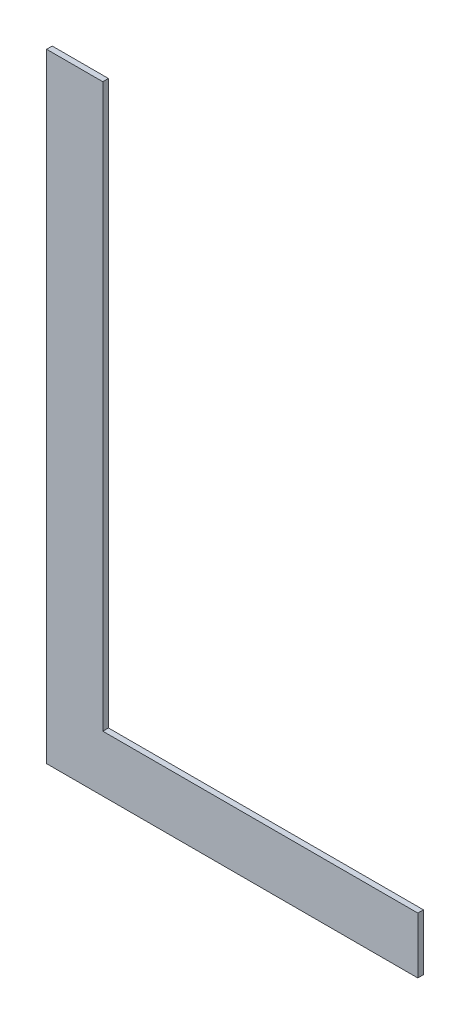
ISO-10303-21;
HEADER;
FILE_DESCRIPTION(('STEP AP214'),'2;1');
FILE_NAME('part.step','',(''),(''),'','','');
FILE_SCHEMA(('AUTOMOTIVE_DESIGN { 1 0 10303 214 1 1 1 1 }'));
ENDSEC;
DATA;
#1=APPLICATION_CONTEXT('core data for automotive mechanical design processes');
#2=APPLICATION_PROTOCOL_DEFINITION('international standard','automotive_design',2000,#1);
#3=PRODUCT_CONTEXT('',#1,'mechanical');
#4=PRODUCT('Part','Part','',(#3));
#5=PRODUCT_RELATED_PRODUCT_CATEGORY('part','',(#4));
#6=PRODUCT_DEFINITION_FORMATION('','',#4);
#7=PRODUCT_DEFINITION_CONTEXT('part definition',#1,'design');
#8=PRODUCT_DEFINITION('design','',#6,#7);
#9=PRODUCT_DEFINITION_SHAPE('','',#8);
#10=(LENGTH_UNIT() NAMED_UNIT(*) SI_UNIT(.MILLI.,.METRE.));
#11=(NAMED_UNIT(*) PLANE_ANGLE_UNIT() SI_UNIT($,.RADIAN.));
#12=(NAMED_UNIT(*) SI_UNIT($,.STERADIAN.) SOLID_ANGLE_UNIT());
#13=UNCERTAINTY_MEASURE_WITH_UNIT(LENGTH_MEASURE(1.E-05),#10,'distance_accuracy_value','');
#14=(GEOMETRIC_REPRESENTATION_CONTEXT(3) GLOBAL_UNCERTAINTY_ASSIGNED_CONTEXT((#13)) GLOBAL_UNIT_ASSIGNED_CONTEXT((#10,
#11,#12)) REPRESENTATION_CONTEXT('',''));
#15=CARTESIAN_POINT('',(0.,0.,0.));
#16=DIRECTION('',(0.,0.,1.));
#17=DIRECTION('',(1.,0.,0.));
#18=AXIS2_PLACEMENT_3D('',#15,#16,#17);
#19=CARTESIAN_POINT('',(-0.32999934,0.55000144,0.01));
#20=DIRECTION('',(0.,0.,-1.));
#21=DIRECTION('',(-1.,0.,0.));
#22=AXIS2_PLACEMENT_3D('',#19,#20,#21);
#23=PLANE('',#22);
#24=DIRECTION('',(1.,0.,0.));
#25=VECTOR('',#24,1.);
#26=CARTESIAN_POINT('',(-0.32999934,-0.5499989,0.01));
#27=LINE('',#26,#25);
#28=CARTESIAN_POINT('',(-0.32999934,-0.5499989,0.01));
#29=VERTEX_POINT('',#28);
#30=CARTESIAN_POINT('',(0.32999934,-0.5499989,0.01));
#31=VERTEX_POINT('',#30);
#32=EDGE_CURVE('E96',#29,#31,#27,.T.);
#33=ORIENTED_EDGE('',*,*,#32,.T.);
#34=DIRECTION('',(0.,1.,0.));
#35=VECTOR('',#34,1.);
#36=CARTESIAN_POINT('',(0.32999934,-0.5499989,0.01));
#37=LINE('',#36,#35);
#38=CARTESIAN_POINT('',(0.32999934,-0.4499991,0.01));
#39=VERTEX_POINT('',#38);
#40=EDGE_CURVE('E92',#31,#39,#37,.T.);
#41=ORIENTED_EDGE('',*,*,#40,.T.);
#42=DIRECTION('',(1.,0.,0.));
#43=VECTOR('',#42,1.);
#44=CARTESIAN_POINT('',(0.32999934,-0.4499991,0.01));
#45=LINE('',#44,#43);
#46=CARTESIAN_POINT('',(-0.22999954,-0.4499991,0.01));
#47=VERTEX_POINT('',#46);
#48=EDGE_CURVE('E68',#39,#47,#45,.F.);
#49=ORIENTED_EDGE('',*,*,#48,.T.);
#50=DIRECTION('',(0.,1.,0.));
#51=VECTOR('',#50,1.);
#52=CARTESIAN_POINT('',(-0.22999954,-0.4499991,0.01));
#53=LINE('',#52,#51);
#54=CARTESIAN_POINT('',(-0.22999954,0.55000144,0.01));
#55=VERTEX_POINT('',#54);
#56=EDGE_CURVE('E70',#47,#55,#53,.T.);
#57=ORIENTED_EDGE('',*,*,#56,.T.);
#58=DIRECTION('',(1.,0.,0.));
#59=VECTOR('',#58,1.);
#60=CARTESIAN_POINT('',(-0.22999954,0.55000144,0.01));
#61=LINE('',#60,#59);
#62=CARTESIAN_POINT('',(-0.32999934,0.55000144,0.01));
#63=VERTEX_POINT('',#62);
#64=EDGE_CURVE('E20',#55,#63,#61,.F.);
#65=ORIENTED_EDGE('',*,*,#64,.T.);
#66=DIRECTION('',(0.,1.,0.));
#67=VECTOR('',#66,1.);
#68=CARTESIAN_POINT('',(-0.32999934,0.55000144,0.01));
#69=LINE('',#68,#67);
#70=EDGE_CURVE('E101',#63,#29,#69,.F.);
#71=ORIENTED_EDGE('',*,*,#70,.T.);
#72=EDGE_LOOP('',(#33,#41,#49,#57,#65,#71));
#73=FACE_BOUND('',#72,.T.);
#74=ADVANCED_FACE('F17',(#73),#23,.F.);
#75=CARTESIAN_POINT('',(-0.22999954,0.55000144,0.));
#76=DIRECTION('',(0.,-1.,0.));
#77=DIRECTION('',(0.,0.,-1.));
#78=AXIS2_PLACEMENT_3D('',#75,#76,#77);
#79=PLANE('',#78);
#80=DIRECTION('',(0.,0.,-1.));
#81=VECTOR('',#80,1.);
#82=CARTESIAN_POINT('',(-0.32999934,0.55000144,0.));
#83=LINE('',#82,#81);
#84=CARTESIAN_POINT('',(-0.32999934,0.55000144,0.));
#85=VERTEX_POINT('',#84);
#86=EDGE_CURVE('E81',#85,#63,#83,.F.);
#87=ORIENTED_EDGE('',*,*,#86,.T.);
#88=ORIENTED_EDGE('',*,*,#64,.F.);
#89=DIRECTION('',(0.,0.,1.));
#90=VECTOR('',#89,1.);
#91=CARTESIAN_POINT('',(-0.22999954,0.55000144,0.));
#92=LINE('',#91,#90);
#93=CARTESIAN_POINT('',(-0.22999954,0.55000144,0.));
#94=VERTEX_POINT('',#93);
#95=EDGE_CURVE('E76',#55,#94,#92,.F.);
#96=ORIENTED_EDGE('',*,*,#95,.T.);
#97=DIRECTION('',(-1.,0.,0.));
#98=VECTOR('',#97,1.);
#99=CARTESIAN_POINT('',(-0.32999934,0.55000144,0.));
#100=LINE('',#99,#98);
#101=EDGE_CURVE('E104',#85,#94,#100,.F.);
#102=ORIENTED_EDGE('',*,*,#101,.F.);
#103=EDGE_LOOP('',(#87,#88,#96,#102));
#104=FACE_BOUND('',#103,.T.);
#105=ADVANCED_FACE('F78',(#104),#79,.F.);
#106=CARTESIAN_POINT('',(-0.22999954,-0.4499991,0.));
#107=DIRECTION('',(-1.,0.,0.));
#108=DIRECTION('',(0.,0.,1.));
#109=AXIS2_PLACEMENT_3D('',#106,#107,#108);
#110=PLANE('',#109);
#111=ORIENTED_EDGE('',*,*,#95,.F.);
#112=ORIENTED_EDGE('',*,*,#56,.F.);
#113=DIRECTION('',(0.,0.,-1.));
#114=VECTOR('',#113,1.);
#115=CARTESIAN_POINT('',(-0.22999954,-0.4499991,0.));
#116=LINE('',#115,#114);
#117=CARTESIAN_POINT('',(-0.22999954,-0.4499991,0.));
#118=VERTEX_POINT('',#117);
#119=EDGE_CURVE('E88',#47,#118,#116,.T.);
#120=ORIENTED_EDGE('',*,*,#119,.T.);
#121=DIRECTION('',(0.,1.,0.));
#122=VECTOR('',#121,1.);
#123=CARTESIAN_POINT('',(-0.22999954,0.55000144,0.));
#124=LINE('',#123,#122);
#125=EDGE_CURVE('E85',#94,#118,#124,.F.);
#126=ORIENTED_EDGE('',*,*,#125,.F.);
#127=EDGE_LOOP('',(#111,#112,#120,#126));
#128=FACE_BOUND('',#127,.T.);
#129=ADVANCED_FACE('F83',(#128),#110,.F.);
#130=CARTESIAN_POINT('',(0.32999934,-0.4499991,0.));
#131=DIRECTION('',(0.,-1.,0.));
#132=DIRECTION('',(0.,0.,-1.));
#133=AXIS2_PLACEMENT_3D('',#130,#131,#132);
#134=PLANE('',#133);
#135=ORIENTED_EDGE('',*,*,#119,.F.);
#136=ORIENTED_EDGE('',*,*,#48,.F.);
#137=DIRECTION('',(0.,0.,1.));
#138=VECTOR('',#137,1.);
#139=CARTESIAN_POINT('',(0.32999934,-0.4499991,0.));
#140=LINE('',#139,#138);
#141=CARTESIAN_POINT('',(0.32999934,-0.4499991,0.));
#142=VERTEX_POINT('',#141);
#143=EDGE_CURVE('E94',#39,#142,#140,.F.);
#144=ORIENTED_EDGE('',*,*,#143,.T.);
#145=DIRECTION('',(-1.,0.,0.));
#146=VECTOR('',#145,1.);
#147=CARTESIAN_POINT('',(-0.32999934,-0.4499991,0.));
#148=LINE('',#147,#146);
#149=EDGE_CURVE('E107',#118,#142,#148,.F.);
#150=ORIENTED_EDGE('',*,*,#149,.F.);
#151=EDGE_LOOP('',(#135,#136,#144,#150));
#152=FACE_BOUND('',#151,.T.);
#153=ADVANCED_FACE('F124',(#152),#134,.F.);
#154=CARTESIAN_POINT('',(0.32999934,-0.5499989,0.));
#155=DIRECTION('',(-1.,0.,0.));
#156=DIRECTION('',(0.,0.,1.));
#157=AXIS2_PLACEMENT_3D('',#154,#155,#156);
#158=PLANE('',#157);
#159=ORIENTED_EDGE('',*,*,#143,.F.);
#160=ORIENTED_EDGE('',*,*,#40,.F.);
#161=DIRECTION('',(0.,0.,1.));
#162=VECTOR('',#161,1.);
#163=CARTESIAN_POINT('',(0.32999934,-0.5499989,0.));
#164=LINE('',#163,#162);
#165=CARTESIAN_POINT('',(0.32999934,-0.5499989,0.));
#166=VERTEX_POINT('',#165);
#167=EDGE_CURVE('E98',#31,#166,#164,.F.);
#168=ORIENTED_EDGE('',*,*,#167,.T.);
#169=DIRECTION('',(0.,1.,0.));
#170=VECTOR('',#169,1.);
#171=CARTESIAN_POINT('',(0.32999934,0.55000144,0.));
#172=LINE('',#171,#170);
#173=EDGE_CURVE('E110',#142,#166,#172,.F.);
#174=ORIENTED_EDGE('',*,*,#173,.F.);
#175=EDGE_LOOP('',(#159,#160,#168,#174));
#176=FACE_BOUND('',#175,.T.);
#177=ADVANCED_FACE('F122',(#176),#158,.F.);
#178=CARTESIAN_POINT('',(-0.32999934,-0.5499989,0.));
#179=DIRECTION('',(0.,1.,0.));
#180=DIRECTION('',(0.,0.,1.));
#181=AXIS2_PLACEMENT_3D('',#178,#179,#180);
#182=PLANE('',#181);
#183=ORIENTED_EDGE('',*,*,#167,.F.);
#184=ORIENTED_EDGE('',*,*,#32,.F.);
#185=DIRECTION('',(0.,0.,-1.));
#186=VECTOR('',#185,1.);
#187=CARTESIAN_POINT('',(-0.32999934,-0.5499989,0.));
#188=LINE('',#187,#186);
#189=CARTESIAN_POINT('',(-0.32999934,-0.5499989,0.));
#190=VERTEX_POINT('',#189);
#191=EDGE_CURVE('E35',#29,#190,#188,.T.);
#192=ORIENTED_EDGE('',*,*,#191,.T.);
#193=DIRECTION('',(-1.,0.,0.));
#194=VECTOR('',#193,1.);
#195=CARTESIAN_POINT('',(-0.32999934,-0.5499989,0.));
#196=LINE('',#195,#194);
#197=EDGE_CURVE('E26',#166,#190,#196,.T.);
#198=ORIENTED_EDGE('',*,*,#197,.F.);
#199=EDGE_LOOP('',(#183,#184,#192,#198));
#200=FACE_BOUND('',#199,.T.);
#201=ADVANCED_FACE('F118',(#200),#182,.F.);
#202=CARTESIAN_POINT('',(-0.32999934,0.55000144,0.));
#203=DIRECTION('',(1.,0.,0.));
#204=DIRECTION('',(0.,0.,-1.));
#205=AXIS2_PLACEMENT_3D('',#202,#203,#204);
#206=PLANE('',#205);
#207=ORIENTED_EDGE('',*,*,#191,.F.);
#208=ORIENTED_EDGE('',*,*,#70,.F.);
#209=ORIENTED_EDGE('',*,*,#86,.F.);
#210=DIRECTION('',(0.,1.,0.));
#211=VECTOR('',#210,1.);
#212=CARTESIAN_POINT('',(-0.32999934,0.55000144,0.));
#213=LINE('',#212,#211);
#214=EDGE_CURVE('E11',#190,#85,#213,.T.);
#215=ORIENTED_EDGE('',*,*,#214,.F.);
#216=EDGE_LOOP('',(#207,#208,#209,#215));
#217=FACE_BOUND('',#216,.T.);
#218=ADVANCED_FACE('F127',(#217),#206,.F.);
#219=CARTESIAN_POINT('',(-0.32999934,0.55000144,0.));
#220=DIRECTION('',(0.,0.,-1.));
#221=DIRECTION('',(-1.,0.,0.));
#222=AXIS2_PLACEMENT_3D('',#219,#220,#221);
#223=PLANE('',#222);
#224=ORIENTED_EDGE('',*,*,#197,.T.);
#225=ORIENTED_EDGE('',*,*,#214,.T.);
#226=ORIENTED_EDGE('',*,*,#101,.T.);
#227=ORIENTED_EDGE('',*,*,#125,.T.);
#228=ORIENTED_EDGE('',*,*,#149,.T.);
#229=ORIENTED_EDGE('',*,*,#173,.T.);
#230=EDGE_LOOP('',(#224,#225,#226,#227,#228,#229));
#231=FACE_BOUND('',#230,.T.);
#232=ADVANCED_FACE('F115',(#231),#223,.T.);
#233=CLOSED_SHELL('',(#74,#105,#129,#153,#177,#201,#218,#232));
#234=MANIFOLD_SOLID_BREP('B1',#233);
#235=ADVANCED_BREP_SHAPE_REPRESENTATION('',(#18,#234),#14);
#236=SHAPE_DEFINITION_REPRESENTATION(#9,#235);
ENDSEC;
END-ISO-10303-21;
